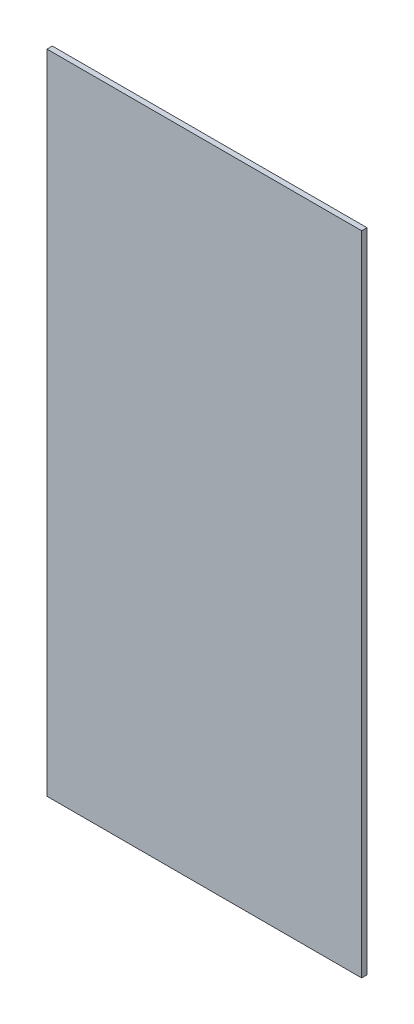
ISO-10303-21;
HEADER;
FILE_DESCRIPTION(('STEP AP214'),'2;1');
FILE_NAME('part.step','',(''),(''),'','','');
FILE_SCHEMA(('AUTOMOTIVE_DESIGN { 1 0 10303 214 1 1 1 1 }'));
ENDSEC;
DATA;
#1=APPLICATION_CONTEXT('core data for automotive mechanical design processes');
#2=APPLICATION_PROTOCOL_DEFINITION('international standard','automotive_design',2000,#1);
#3=PRODUCT_CONTEXT('',#1,'mechanical');
#4=PRODUCT('Part','Part','',(#3));
#5=PRODUCT_RELATED_PRODUCT_CATEGORY('part','',(#4));
#6=PRODUCT_DEFINITION_FORMATION('','',#4);
#7=PRODUCT_DEFINITION_CONTEXT('part definition',#1,'design');
#8=PRODUCT_DEFINITION('design','',#6,#7);
#9=PRODUCT_DEFINITION_SHAPE('','',#8);
#10=(LENGTH_UNIT() NAMED_UNIT(*) SI_UNIT(.MILLI.,.METRE.));
#11=(NAMED_UNIT(*) PLANE_ANGLE_UNIT() SI_UNIT($,.RADIAN.));
#12=(NAMED_UNIT(*) SI_UNIT($,.STERADIAN.) SOLID_ANGLE_UNIT());
#13=UNCERTAINTY_MEASURE_WITH_UNIT(LENGTH_MEASURE(1.E-05),#10,'distance_accuracy_value','');
#14=(GEOMETRIC_REPRESENTATION_CONTEXT(3) GLOBAL_UNCERTAINTY_ASSIGNED_CONTEXT((#13)) GLOBAL_UNIT_ASSIGNED_CONTEXT((#10,
#11,#12)) REPRESENTATION_CONTEXT('',''));
#15=CARTESIAN_POINT('',(0.,0.,0.));
#16=DIRECTION('',(0.,0.,1.));
#17=DIRECTION('',(1.,0.,0.));
#18=AXIS2_PLACEMENT_3D('',#15,#16,#17);
#19=CARTESIAN_POINT('',(0.,0.,15.));
#20=DIRECTION('',(1.,0.,0.));
#21=DIRECTION('',(0.,0.,-1.));
#22=AXIS2_PLACEMENT_3D('',#19,#20,#21);
#23=PLANE('',#22);
#24=DIRECTION('',(0.,-1.,0.));
#25=VECTOR('',#24,1.);
#26=CARTESIAN_POINT('',(0.,0.,0.));
#27=LINE('',#26,#25);
#28=CARTESIAN_POINT('',(0.,1830.,0.));
#29=VERTEX_POINT('',#28);
#30=CARTESIAN_POINT('',(0.,0.,0.));
#31=VERTEX_POINT('',#30);
#32=EDGE_CURVE('E112',#29,#31,#27,.T.);
#33=ORIENTED_EDGE('',*,*,#32,.T.);
#34=DIRECTION('',(0.,0.,-1.));
#35=VECTOR('',#34,1.);
#36=CARTESIAN_POINT('',(0.,0.,15.));
#37=LINE('',#36,#35);
#38=CARTESIAN_POINT('',(0.,0.,15.));
#39=VERTEX_POINT('',#38);
#40=EDGE_CURVE('E11',#39,#31,#37,.T.);
#41=ORIENTED_EDGE('',*,*,#40,.F.);
#42=DIRECTION('',(0.,-1.,0.));
#43=VECTOR('',#42,1.);
#44=CARTESIAN_POINT('',(0.,0.,15.));
#45=LINE('',#44,#43);
#46=CARTESIAN_POINT('',(0.,1830.,15.));
#47=VERTEX_POINT('',#46);
#48=EDGE_CURVE('E95',#47,#39,#45,.T.);
#49=ORIENTED_EDGE('',*,*,#48,.F.);
#50=DIRECTION('',(0.,0.,-1.));
#51=VECTOR('',#50,1.);
#52=CARTESIAN_POINT('',(0.,1830.,15.));
#53=LINE('',#52,#51);
#54=EDGE_CURVE('E108',#47,#29,#53,.T.);
#55=ORIENTED_EDGE('',*,*,#54,.T.);
#56=EDGE_LOOP('',(#33,#41,#49,#55));
#57=FACE_BOUND('',#56,.T.);
#58=ADVANCED_FACE('F38',(#57),#23,.F.);
#59=CARTESIAN_POINT('',(0.,0.,15.));
#60=DIRECTION('',(0.,1.,0.));
#61=DIRECTION('',(0.,0.,1.));
#62=AXIS2_PLACEMENT_3D('',#59,#60,#61);
#63=PLANE('',#62);
#64=DIRECTION('',(1.,0.,0.));
#65=VECTOR('',#64,1.);
#66=CARTESIAN_POINT('',(0.,0.,0.));
#67=LINE('',#66,#65);
#68=CARTESIAN_POINT('',(890.,0.,0.));
#69=VERTEX_POINT('',#68);
#70=EDGE_CURVE('E100',#31,#69,#67,.T.);
#71=ORIENTED_EDGE('',*,*,#70,.T.);
#72=DIRECTION('',(0.,0.,-1.));
#73=VECTOR('',#72,1.);
#74=CARTESIAN_POINT('',(890.,0.,15.));
#75=LINE('',#74,#73);
#76=CARTESIAN_POINT('',(890.,0.,15.));
#77=VERTEX_POINT('',#76);
#78=EDGE_CURVE('E46',#77,#69,#75,.T.);
#79=ORIENTED_EDGE('',*,*,#78,.F.);
#80=DIRECTION('',(1.,0.,0.));
#81=VECTOR('',#80,1.);
#82=CARTESIAN_POINT('',(0.,0.,15.));
#83=LINE('',#82,#81);
#84=EDGE_CURVE('E90',#39,#77,#83,.T.);
#85=ORIENTED_EDGE('',*,*,#84,.F.);
#86=ORIENTED_EDGE('',*,*,#40,.T.);
#87=EDGE_LOOP('',(#71,#79,#85,#86));
#88=FACE_BOUND('',#87,.T.);
#89=ADVANCED_FACE('F99',(#88),#63,.F.);
#90=CARTESIAN_POINT('',(890.,0.,15.));
#91=DIRECTION('',(-1.,0.,0.));
#92=DIRECTION('',(0.,0.,1.));
#93=AXIS2_PLACEMENT_3D('',#90,#91,#92);
#94=PLANE('',#93);
#95=DIRECTION('',(0.,1.,0.));
#96=VECTOR('',#95,1.);
#97=CARTESIAN_POINT('',(890.,0.,0.));
#98=LINE('',#97,#96);
#99=CARTESIAN_POINT('',(890.,1830.,0.));
#100=VERTEX_POINT('',#99);
#101=EDGE_CURVE('E77',#69,#100,#98,.T.);
#102=ORIENTED_EDGE('',*,*,#101,.T.);
#103=DIRECTION('',(0.,0.,-1.));
#104=VECTOR('',#103,1.);
#105=CARTESIAN_POINT('',(890.,1830.,15.));
#106=LINE('',#105,#104);
#107=CARTESIAN_POINT('',(890.,1830.,15.));
#108=VERTEX_POINT('',#107);
#109=EDGE_CURVE('E102',#108,#100,#106,.T.);
#110=ORIENTED_EDGE('',*,*,#109,.F.);
#111=DIRECTION('',(0.,1.,0.));
#112=VECTOR('',#111,1.);
#113=CARTESIAN_POINT('',(890.,0.,15.));
#114=LINE('',#113,#112);
#115=EDGE_CURVE('E93',#77,#108,#114,.T.);
#116=ORIENTED_EDGE('',*,*,#115,.F.);
#117=ORIENTED_EDGE('',*,*,#78,.T.);
#118=EDGE_LOOP('',(#102,#110,#116,#117));
#119=FACE_BOUND('',#118,.T.);
#120=ADVANCED_FACE('F103',(#119),#94,.F.);
#121=CARTESIAN_POINT('',(0.,1830.,15.));
#122=DIRECTION('',(0.,-1.,0.));
#123=DIRECTION('',(0.,0.,-1.));
#124=AXIS2_PLACEMENT_3D('',#121,#122,#123);
#125=PLANE('',#124);
#126=DIRECTION('',(-1.,0.,0.));
#127=VECTOR('',#126,1.);
#128=CARTESIAN_POINT('',(0.,1830.,0.));
#129=LINE('',#128,#127);
#130=EDGE_CURVE('E83',#100,#29,#129,.T.);
#131=ORIENTED_EDGE('',*,*,#130,.T.);
#132=ORIENTED_EDGE('',*,*,#54,.F.);
#133=DIRECTION('',(-1.,0.,0.));
#134=VECTOR('',#133,1.);
#135=CARTESIAN_POINT('',(0.,1830.,15.));
#136=LINE('',#135,#134);
#137=EDGE_CURVE('E57',#108,#47,#136,.T.);
#138=ORIENTED_EDGE('',*,*,#137,.F.);
#139=ORIENTED_EDGE('',*,*,#109,.T.);
#140=EDGE_LOOP('',(#131,#132,#138,#139));
#141=FACE_BOUND('',#140,.T.);
#142=ADVANCED_FACE('F124',(#141),#125,.F.);
#143=CARTESIAN_POINT('',(0.,0.,15.));
#144=DIRECTION('',(0.,0.,-1.));
#145=DIRECTION('',(-1.,0.,0.));
#146=AXIS2_PLACEMENT_3D('',#143,#144,#145);
#147=PLANE('',#146);
#148=ORIENTED_EDGE('',*,*,#48,.T.);
#149=ORIENTED_EDGE('',*,*,#84,.T.);
#150=ORIENTED_EDGE('',*,*,#115,.T.);
#151=ORIENTED_EDGE('',*,*,#137,.T.);
#152=EDGE_LOOP('',(#148,#149,#150,#151));
#153=FACE_BOUND('',#152,.T.);
#154=ADVANCED_FACE('F91',(#153),#147,.F.);
#155=CARTESIAN_POINT('',(0.,0.,0.));
#156=DIRECTION('',(0.,0.,-1.));
#157=DIRECTION('',(-1.,0.,0.));
#158=AXIS2_PLACEMENT_3D('',#155,#156,#157);
#159=PLANE('',#158);
#160=ORIENTED_EDGE('',*,*,#32,.F.);
#161=ORIENTED_EDGE('',*,*,#130,.F.);
#162=ORIENTED_EDGE('',*,*,#101,.F.);
#163=ORIENTED_EDGE('',*,*,#70,.F.);
#164=EDGE_LOOP('',(#160,#161,#162,#163));
#165=FACE_BOUND('',#164,.T.);
#166=ADVANCED_FACE('F127',(#165),#159,.T.);
#167=CLOSED_SHELL('',(#58,#89,#120,#142,#154,#166));
#168=MANIFOLD_SOLID_BREP('B2',#167);
#169=ADVANCED_BREP_SHAPE_REPRESENTATION('',(#18,#168),#14);
#170=SHAPE_DEFINITION_REPRESENTATION(#9,#169);
ENDSEC;
END-ISO-10303-21;
